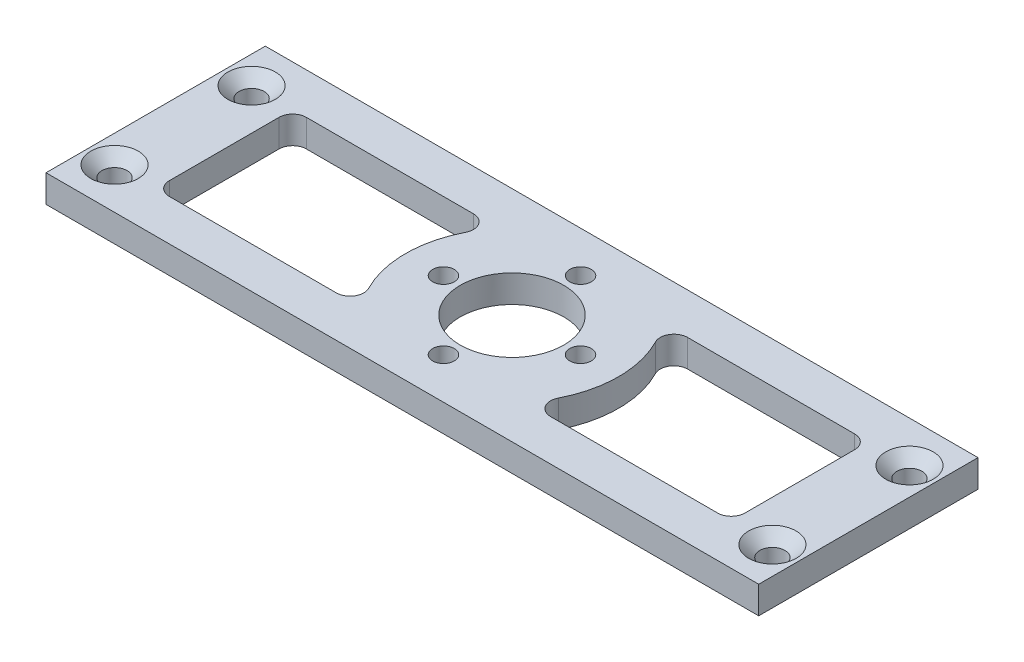
ISO-10303-21;
HEADER;
FILE_DESCRIPTION(('STEP AP214'),'2;1');
FILE_NAME('part.step','',(''),(''),'','','');
FILE_SCHEMA(('AUTOMOTIVE_DESIGN { 1 0 10303 214 1 1 1 1 }'));
ENDSEC;
DATA;
#1=APPLICATION_CONTEXT('core data for automotive mechanical design processes');
#2=APPLICATION_PROTOCOL_DEFINITION('international standard','automotive_design',2000,#1);
#3=PRODUCT_CONTEXT('',#1,'mechanical');
#4=PRODUCT('Part','Part','',(#3));
#5=PRODUCT_RELATED_PRODUCT_CATEGORY('part','',(#4));
#6=PRODUCT_DEFINITION_FORMATION('','',#4);
#7=PRODUCT_DEFINITION_CONTEXT('part definition',#1,'design');
#8=PRODUCT_DEFINITION('design','',#6,#7);
#9=PRODUCT_DEFINITION_SHAPE('','',#8);
#10=(LENGTH_UNIT() NAMED_UNIT(*) SI_UNIT(.MILLI.,.METRE.));
#11=(NAMED_UNIT(*) PLANE_ANGLE_UNIT() SI_UNIT($,.RADIAN.));
#12=(NAMED_UNIT(*) SI_UNIT($,.STERADIAN.) SOLID_ANGLE_UNIT());
#13=UNCERTAINTY_MEASURE_WITH_UNIT(LENGTH_MEASURE(1.E-05),#10,'distance_accuracy_value','');
#14=(GEOMETRIC_REPRESENTATION_CONTEXT(3) GLOBAL_UNCERTAINTY_ASSIGNED_CONTEXT((#13)) GLOBAL_UNIT_ASSIGNED_CONTEXT((#10,
#11,#12)) REPRESENTATION_CONTEXT('',''));
#15=CARTESIAN_POINT('',(0.,0.,0.));
#16=DIRECTION('',(0.,0.,1.));
#17=DIRECTION('',(1.,0.,0.));
#18=AXIS2_PLACEMENT_3D('',#15,#16,#17);
#19=CARTESIAN_POINT('',(0.,1.5875,0.));
#20=DIRECTION('',(0.,-1.,0.));
#21=DIRECTION('',(0.,0.,-1.));
#22=AXIS2_PLACEMENT_3D('',#19,#20,#21);
#23=PLANE('',#22);
#24=CARTESIAN_POINT('',(38.1,1.5875,-7.9375));
#25=DIRECTION('',(0.,1.,0.));
#26=DIRECTION('',(0.,0.,1.));
#27=AXIS2_PLACEMENT_3D('',#24,#25,#26);
#28=CIRCLE('',#27,2.75);
#29=CARTESIAN_POINT('',(38.1,1.5875,-5.1875));
#30=VERTEX_POINT('',#29);
#31=EDGE_CURVE('E373',#30,#30,#28,.T.);
#32=ORIENTED_EDGE('',*,*,#31,.F.);
#33=EDGE_LOOP('',(#32));
#34=FACE_BOUND('',#33,.T.);
#35=CARTESIAN_POINT('',(38.1,1.5875,7.9375));
#36=DIRECTION('',(0.,1.,0.));
#37=DIRECTION('',(0.,0.,1.));
#38=AXIS2_PLACEMENT_3D('',#35,#36,#37);
#39=CIRCLE('',#38,2.75);
#40=CARTESIAN_POINT('',(38.1,1.5875,10.6875));
#41=VERTEX_POINT('',#40);
#42=EDGE_CURVE('E395',#41,#41,#39,.T.);
#43=ORIENTED_EDGE('',*,*,#42,.F.);
#44=EDGE_LOOP('',(#43));
#45=FACE_BOUND('',#44,.T.);
#46=CARTESIAN_POINT('',(-38.1,1.5875,-7.9375));
#47=DIRECTION('',(0.,1.,0.));
#48=DIRECTION('',(0.,0.,1.));
#49=AXIS2_PLACEMENT_3D('',#46,#47,#48);
#50=CIRCLE('',#49,2.75);
#51=CARTESIAN_POINT('',(-38.1,1.5875,-5.1875));
#52=VERTEX_POINT('',#51);
#53=EDGE_CURVE('E407',#52,#52,#50,.T.);
#54=ORIENTED_EDGE('',*,*,#53,.F.);
#55=EDGE_LOOP('',(#54));
#56=FACE_BOUND('',#55,.T.);
#57=CARTESIAN_POINT('',(-38.1,1.5875,7.9375));
#58=DIRECTION('',(0.,1.,0.));
#59=DIRECTION('',(0.,0.,1.));
#60=AXIS2_PLACEMENT_3D('',#57,#58,#59);
#61=CIRCLE('',#60,2.75);
#62=CARTESIAN_POINT('',(-38.1,1.5875,10.6875));
#63=VERTEX_POINT('',#62);
#64=EDGE_CURVE('E419',#63,#63,#61,.T.);
#65=ORIENTED_EDGE('',*,*,#64,.F.);
#66=EDGE_LOOP('',(#65));
#67=FACE_BOUND('',#66,.T.);
#68=CARTESIAN_POINT('',(0.,1.5875,-7.9375));
#69=DIRECTION('',(0.,1.,0.));
#70=DIRECTION('',(0.,0.,1.));
#71=AXIS2_PLACEMENT_3D('',#68,#69,#70);
#72=CIRCLE('',#71,1.25);
#73=CARTESIAN_POINT('',(0.,1.5875,-6.6875));
#74=VERTEX_POINT('',#73);
#75=EDGE_CURVE('E431',#74,#74,#72,.T.);
#76=ORIENTED_EDGE('',*,*,#75,.F.);
#77=EDGE_LOOP('',(#76));
#78=FACE_BOUND('',#77,.T.);
#79=CARTESIAN_POINT('',(-7.9375,1.5875,0.));
#80=DIRECTION('',(0.,1.,0.));
#81=DIRECTION('',(0.,0.,1.));
#82=AXIS2_PLACEMENT_3D('',#79,#80,#81);
#83=CIRCLE('',#82,1.25);
#84=CARTESIAN_POINT('',(-7.9375,1.5875,1.25));
#85=VERTEX_POINT('',#84);
#86=EDGE_CURVE('E439',#85,#85,#83,.T.);
#87=ORIENTED_EDGE('',*,*,#86,.F.);
#88=EDGE_LOOP('',(#87));
#89=FACE_BOUND('',#88,.T.);
#90=CARTESIAN_POINT('',(7.9375,1.5875,0.));
#91=DIRECTION('',(0.,1.,0.));
#92=DIRECTION('',(0.,0.,1.));
#93=AXIS2_PLACEMENT_3D('',#90,#91,#92);
#94=CIRCLE('',#93,1.25);
#95=CARTESIAN_POINT('',(7.9375,1.5875,1.25));
#96=VERTEX_POINT('',#95);
#97=EDGE_CURVE('E447',#96,#96,#94,.T.);
#98=ORIENTED_EDGE('',*,*,#97,.F.);
#99=EDGE_LOOP('',(#98));
#100=FACE_BOUND('',#99,.T.);
#101=DIRECTION('',(0.,0.,-1.));
#102=VECTOR('',#101,1.);
#103=CARTESIAN_POINT('',(-41.275,1.5875,12.7));
#104=LINE('',#103,#102);
#105=CARTESIAN_POINT('',(-41.275,1.5875,12.7));
#106=VERTEX_POINT('',#105);
#107=CARTESIAN_POINT('',(-41.275,1.5875,-12.7));
#108=VERTEX_POINT('',#107);
#109=EDGE_CURVE('E201',#106,#108,#104,.T.);
#110=ORIENTED_EDGE('',*,*,#109,.F.);
#111=DIRECTION('',(1.,0.,0.));
#112=VECTOR('',#111,1.);
#113=CARTESIAN_POINT('',(-41.275,1.5875,12.7));
#114=LINE('',#113,#112);
#115=CARTESIAN_POINT('',(41.275,1.5875,12.7));
#116=VERTEX_POINT('',#115);
#117=EDGE_CURVE('E196',#106,#116,#114,.T.);
#118=ORIENTED_EDGE('',*,*,#117,.T.);
#119=DIRECTION('',(0.,0.,-1.));
#120=VECTOR('',#119,1.);
#121=CARTESIAN_POINT('',(41.275,1.5875,12.7));
#122=LINE('',#121,#120);
#123=CARTESIAN_POINT('',(41.275,1.5875,-12.7));
#124=VERTEX_POINT('',#123);
#125=EDGE_CURVE('E203',#116,#124,#122,.T.);
#126=ORIENTED_EDGE('',*,*,#125,.T.);
#127=DIRECTION('',(1.,0.,0.));
#128=VECTOR('',#127,1.);
#129=CARTESIAN_POINT('',(-41.275,1.5875,-12.7));
#130=LINE('',#129,#128);
#131=EDGE_CURVE('E187',#108,#124,#130,.T.);
#132=ORIENTED_EDGE('',*,*,#131,.F.);
#133=EDGE_LOOP('',(#110,#118,#126,#132));
#134=FACE_BOUND('',#133,.T.);
#135=CARTESIAN_POINT('',(0.,1.5875,0.));
#136=DIRECTION('',(0.,1.,0.));
#137=DIRECTION('',(0.,0.,1.));
#138=AXIS2_PLACEMENT_3D('',#135,#136,#137);
#139=CIRCLE('',#138,6.);
#140=CARTESIAN_POINT('',(0.,1.5875,6.));
#141=VERTEX_POINT('',#140);
#142=EDGE_CURVE('E462',#141,#141,#139,.T.);
#143=ORIENTED_EDGE('',*,*,#142,.F.);
#144=EDGE_LOOP('',(#143));
#145=FACE_BOUND('',#144,.T.);
#146=CARTESIAN_POINT('',(0.,1.5875,7.9375));
#147=DIRECTION('',(0.,1.,0.));
#148=DIRECTION('',(0.,0.,1.));
#149=AXIS2_PLACEMENT_3D('',#146,#147,#148);
#150=CIRCLE('',#149,1.25);
#151=CARTESIAN_POINT('',(0.,1.5875,9.1875));
#152=VERTEX_POINT('',#151);
#153=EDGE_CURVE('E455',#152,#152,#150,.T.);
#154=ORIENTED_EDGE('',*,*,#153,.F.);
#155=EDGE_LOOP('',(#154));
#156=FACE_BOUND('',#155,.T.);
#157=DIRECTION('',(0.,0.,1.));
#158=VECTOR('',#157,1.);
#159=CARTESIAN_POINT('',(-33.3375,1.5875,-7.9375));
#160=LINE('',#159,#158);
#161=CARTESIAN_POINT('',(-33.3375,1.5875,-6.35));
#162=VERTEX_POINT('',#161);
#163=CARTESIAN_POINT('',(-33.3375,1.5875,6.35));
#164=VERTEX_POINT('',#163);
#165=EDGE_CURVE('E344',#162,#164,#160,.T.);
#166=ORIENTED_EDGE('',*,*,#165,.F.);
#167=CARTESIAN_POINT('',(-31.75,1.5875,-6.35));
#168=DIRECTION('',(0.,-1.,0.));
#169=DIRECTION('',(0.,0.,-1.));
#170=AXIS2_PLACEMENT_3D('',#167,#168,#169);
#171=CIRCLE('',#170,1.5875);
#172=CARTESIAN_POINT('',(-31.75,1.5875,-7.9375));
#173=VERTEX_POINT('',#172);
#174=EDGE_CURVE('E55',#162,#173,#171,.T.);
#175=ORIENTED_EDGE('',*,*,#174,.T.);
#176=DIRECTION('',(-1.,0.,0.));
#177=VECTOR('',#176,1.);
#178=CARTESIAN_POINT('',(-33.3375,1.5875,-7.9375));
#179=LINE('',#178,#177);
#180=CARTESIAN_POINT('',(-12.4069096172254,1.5875,-7.9375));
#181=VERTEX_POINT('',#180);
#182=EDGE_CURVE('E343',#181,#173,#179,.T.);
#183=ORIENTED_EDGE('',*,*,#182,.F.);
#184=CARTESIAN_POINT('',(-12.4069096172254,1.5875,-6.35));
#185=DIRECTION('',(0.,-1.,0.));
#186=DIRECTION('',(0.,0.,-1.));
#187=AXIS2_PLACEMENT_3D('',#184,#185,#186);
#188=CIRCLE('',#187,1.5875);
#189=CARTESIAN_POINT('',(-10.9937459209136,1.5875,-5.6267264573991));
#190=VERTEX_POINT('',#189);
#191=EDGE_CURVE('E320',#181,#190,#188,.T.);
#192=ORIENTED_EDGE('',*,*,#191,.T.);
#193=CARTESIAN_POINT('',(0.,1.5875,0.));
#194=DIRECTION('',(0.,-1.,0.));
#195=DIRECTION('',(0.,0.,1.));
#196=AXIS2_PLACEMENT_3D('',#193,#194,#195);
#197=CIRCLE('',#196,12.35);
#198=CARTESIAN_POINT('',(-10.9937459209136,1.5875,5.6267264573991));
#199=VERTEX_POINT('',#198);
#200=EDGE_CURVE('E367',#199,#190,#197,.T.);
#201=ORIENTED_EDGE('',*,*,#200,.F.);
#202=CARTESIAN_POINT('',(-12.4069096172254,1.5875,6.35));
#203=DIRECTION('',(0.,-1.,0.));
#204=DIRECTION('',(0.,0.,-1.));
#205=AXIS2_PLACEMENT_3D('',#202,#203,#204);
#206=CIRCLE('',#205,1.5875);
#207=CARTESIAN_POINT('',(-12.4069096172254,1.5875,7.9375));
#208=VERTEX_POINT('',#207);
#209=EDGE_CURVE('E326',#199,#208,#206,.T.);
#210=ORIENTED_EDGE('',*,*,#209,.T.);
#211=DIRECTION('',(1.,0.,0.));
#212=VECTOR('',#211,1.);
#213=CARTESIAN_POINT('',(-33.3375,1.5875,7.9375));
#214=LINE('',#213,#212);
#215=CARTESIAN_POINT('',(-31.75,1.5875,7.9375));
#216=VERTEX_POINT('',#215);
#217=EDGE_CURVE('E377',#216,#208,#214,.T.);
#218=ORIENTED_EDGE('',*,*,#217,.F.);
#219=CARTESIAN_POINT('',(-31.75,1.5875,6.35));
#220=DIRECTION('',(0.,-1.,0.));
#221=DIRECTION('',(0.,0.,-1.));
#222=AXIS2_PLACEMENT_3D('',#219,#220,#221);
#223=CIRCLE('',#222,1.5875);
#224=EDGE_CURVE('E332',#216,#164,#223,.T.);
#225=ORIENTED_EDGE('',*,*,#224,.T.);
#226=EDGE_LOOP('',(#166,#175,#183,#192,#201,#210,#218,#225));
#227=FACE_BOUND('',#226,.T.);
#228=CARTESIAN_POINT('',(0.,1.5875,0.));
#229=DIRECTION('',(0.,1.,0.));
#230=DIRECTION('',(0.,0.,1.));
#231=AXIS2_PLACEMENT_3D('',#228,#229,#230);
#232=CIRCLE('',#231,12.35);
#233=CARTESIAN_POINT('',(10.9937459209136,1.5875,5.6267264573991));
#234=VERTEX_POINT('',#233);
#235=CARTESIAN_POINT('',(10.9937459209136,1.5875,-5.6267264573991));
#236=VERTEX_POINT('',#235);
#237=EDGE_CURVE('E508',#234,#236,#232,.T.);
#238=ORIENTED_EDGE('',*,*,#237,.T.);
#239=CARTESIAN_POINT('',(12.4069096172254,1.5875,-6.35));
#240=DIRECTION('',(0.,-1.,0.));
#241=DIRECTION('',(0.,0.,-1.));
#242=AXIS2_PLACEMENT_3D('',#239,#240,#241);
#243=CIRCLE('',#242,1.5875);
#244=CARTESIAN_POINT('',(12.4069096172254,1.5875,-7.9375));
#245=VERTEX_POINT('',#244);
#246=EDGE_CURVE('E296',#236,#245,#243,.T.);
#247=ORIENTED_EDGE('',*,*,#246,.T.);
#248=DIRECTION('',(1.,0.,0.));
#249=VECTOR('',#248,1.);
#250=CARTESIAN_POINT('',(33.3375,1.5875,-7.9375));
#251=LINE('',#250,#249);
#252=CARTESIAN_POINT('',(31.75,1.5875,-7.9375));
#253=VERTEX_POINT('',#252);
#254=EDGE_CURVE('E501',#245,#253,#251,.T.);
#255=ORIENTED_EDGE('',*,*,#254,.T.);
#256=CARTESIAN_POINT('',(31.75,1.5875,-6.35));
#257=DIRECTION('',(0.,-1.,0.));
#258=DIRECTION('',(0.,0.,-1.));
#259=AXIS2_PLACEMENT_3D('',#256,#257,#258);
#260=CIRCLE('',#259,1.5875);
#261=CARTESIAN_POINT('',(33.3375,1.5875,-6.35));
#262=VERTEX_POINT('',#261);
#263=EDGE_CURVE('E314',#253,#262,#260,.T.);
#264=ORIENTED_EDGE('',*,*,#263,.T.);
#265=DIRECTION('',(0.,0.,1.));
#266=VECTOR('',#265,1.);
#267=CARTESIAN_POINT('',(33.3375,1.5875,-7.9375));
#268=LINE('',#267,#266);
#269=CARTESIAN_POINT('',(33.3375,1.5875,6.35));
#270=VERTEX_POINT('',#269);
#271=EDGE_CURVE('E517',#262,#270,#268,.T.);
#272=ORIENTED_EDGE('',*,*,#271,.T.);
#273=CARTESIAN_POINT('',(31.75,1.5875,6.35));
#274=DIRECTION('',(0.,-1.,0.));
#275=DIRECTION('',(0.,0.,-1.));
#276=AXIS2_PLACEMENT_3D('',#273,#274,#275);
#277=CIRCLE('',#276,1.5875);
#278=CARTESIAN_POINT('',(31.75,1.5875,7.9375));
#279=VERTEX_POINT('',#278);
#280=EDGE_CURVE('E308',#270,#279,#277,.T.);
#281=ORIENTED_EDGE('',*,*,#280,.T.);
#282=DIRECTION('',(-1.,0.,0.));
#283=VECTOR('',#282,1.);
#284=CARTESIAN_POINT('',(33.3375,1.5875,7.9375));
#285=LINE('',#284,#283);
#286=CARTESIAN_POINT('',(12.4069096172254,1.5875,7.9375));
#287=VERTEX_POINT('',#286);
#288=EDGE_CURVE('E511',#279,#287,#285,.T.);
#289=ORIENTED_EDGE('',*,*,#288,.T.);
#290=CARTESIAN_POINT('',(12.4069096172254,1.5875,6.35));
#291=DIRECTION('',(0.,-1.,0.));
#292=DIRECTION('',(0.,0.,-1.));
#293=AXIS2_PLACEMENT_3D('',#290,#291,#292);
#294=CIRCLE('',#293,1.5875);
#295=EDGE_CURVE('E302',#287,#234,#294,.T.);
#296=ORIENTED_EDGE('',*,*,#295,.T.);
#297=EDGE_LOOP('',(#238,#247,#255,#264,#272,#281,#289,#296));
#298=FACE_BOUND('',#297,.T.);
#299=ADVANCED_FACE('F46',(#34,#45,#56,#67,#78,#89,#100,#134,#145,#156,#227,#298),#23,.F.);
#300=CARTESIAN_POINT('',(0.,-1.5875,0.));
#301=DIRECTION('',(0.,-1.,0.));
#302=DIRECTION('',(0.,0.,-1.));
#303=AXIS2_PLACEMENT_3D('',#300,#301,#302);
#304=PLANE('',#303);
#305=CARTESIAN_POINT('',(0.,-1.5875,0.));
#306=DIRECTION('',(0.,-1.,0.));
#307=DIRECTION('',(0.,0.,1.));
#308=AXIS2_PLACEMENT_3D('',#305,#306,#307);
#309=CIRCLE('',#308,12.35);
#310=CARTESIAN_POINT('',(-10.9937459209136,-1.5875,5.6267264573991));
#311=VERTEX_POINT('',#310);
#312=CARTESIAN_POINT('',(-10.9937459209136,-1.5875,-5.6267264573991));
#313=VERTEX_POINT('',#312);
#314=EDGE_CURVE('E365',#311,#313,#309,.T.);
#315=ORIENTED_EDGE('',*,*,#314,.T.);
#316=CARTESIAN_POINT('',(-12.4069096172254,-1.5875,-6.35));
#317=DIRECTION('',(0.,-1.,0.));
#318=DIRECTION('',(0.,0.,-1.));
#319=AXIS2_PLACEMENT_3D('',#316,#317,#318);
#320=CIRCLE('',#319,1.5875);
#321=CARTESIAN_POINT('',(-12.4069096172254,-1.5875,-7.9375));
#322=VERTEX_POINT('',#321);
#323=EDGE_CURVE('E323',#313,#322,#320,.F.);
#324=ORIENTED_EDGE('',*,*,#323,.T.);
#325=DIRECTION('',(-1.,0.,0.));
#326=VECTOR('',#325,1.);
#327=CARTESIAN_POINT('',(-33.3375,-1.5875,-7.9375));
#328=LINE('',#327,#326);
#329=CARTESIAN_POINT('',(-31.75,-1.5875,-7.9375));
#330=VERTEX_POINT('',#329);
#331=EDGE_CURVE('E360',#322,#330,#328,.T.);
#332=ORIENTED_EDGE('',*,*,#331,.T.);
#333=CARTESIAN_POINT('',(-31.75,-1.5875,-6.35));
#334=DIRECTION('',(0.,-1.,0.));
#335=DIRECTION('',(0.,0.,-1.));
#336=AXIS2_PLACEMENT_3D('',#333,#334,#335);
#337=CIRCLE('',#336,1.5875);
#338=CARTESIAN_POINT('',(-33.3375,-1.5875,-6.35));
#339=VERTEX_POINT('',#338);
#340=EDGE_CURVE('E11',#330,#339,#337,.F.);
#341=ORIENTED_EDGE('',*,*,#340,.T.);
#342=DIRECTION('',(0.,0.,1.));
#343=VECTOR('',#342,1.);
#344=CARTESIAN_POINT('',(-33.3375,-1.5875,-7.9375));
#345=LINE('',#344,#343);
#346=CARTESIAN_POINT('',(-33.3375,-1.5875,6.35));
#347=VERTEX_POINT('',#346);
#348=EDGE_CURVE('E356',#339,#347,#345,.T.);
#349=ORIENTED_EDGE('',*,*,#348,.T.);
#350=CARTESIAN_POINT('',(-31.75,-1.5875,6.35));
#351=DIRECTION('',(0.,-1.,0.));
#352=DIRECTION('',(0.,0.,-1.));
#353=AXIS2_PLACEMENT_3D('',#350,#351,#352);
#354=CIRCLE('',#353,1.5875);
#355=CARTESIAN_POINT('',(-31.75,-1.5875,7.9375));
#356=VERTEX_POINT('',#355);
#357=EDGE_CURVE('E335',#347,#356,#354,.F.);
#358=ORIENTED_EDGE('',*,*,#357,.T.);
#359=DIRECTION('',(1.,0.,0.));
#360=VECTOR('',#359,1.);
#361=CARTESIAN_POINT('',(-33.3375,-1.5875,7.9375));
#362=LINE('',#361,#360);
#363=CARTESIAN_POINT('',(-12.4069096172254,-1.5875,7.9375));
#364=VERTEX_POINT('',#363);
#365=EDGE_CURVE('E359',#356,#364,#362,.T.);
#366=ORIENTED_EDGE('',*,*,#365,.T.);
#367=CARTESIAN_POINT('',(-12.4069096172254,-1.5875,6.35));
#368=DIRECTION('',(0.,-1.,0.));
#369=DIRECTION('',(0.,0.,-1.));
#370=AXIS2_PLACEMENT_3D('',#367,#368,#369);
#371=CIRCLE('',#370,1.5875);
#372=EDGE_CURVE('E329',#364,#311,#371,.F.);
#373=ORIENTED_EDGE('',*,*,#372,.T.);
#374=EDGE_LOOP('',(#315,#324,#332,#341,#349,#358,#366,#373));
#375=FACE_BOUND('',#374,.T.);
#376=CARTESIAN_POINT('',(38.1,-1.5875,-7.9375));
#377=DIRECTION('',(0.,-1.,0.));
#378=DIRECTION('',(0.,0.,-1.));
#379=AXIS2_PLACEMENT_3D('',#376,#377,#378);
#380=CIRCLE('',#379,1.45);
#381=CARTESIAN_POINT('',(38.1,-1.5875,-9.3875));
#382=VERTEX_POINT('',#381);
#383=EDGE_CURVE('E391',#382,#382,#380,.T.);
#384=ORIENTED_EDGE('',*,*,#383,.F.);
#385=EDGE_LOOP('',(#384));
#386=FACE_BOUND('',#385,.T.);
#387=CARTESIAN_POINT('',(38.1,-1.5875,7.9375));
#388=DIRECTION('',(0.,-1.,0.));
#389=DIRECTION('',(0.,0.,-1.));
#390=AXIS2_PLACEMENT_3D('',#387,#388,#389);
#391=CIRCLE('',#390,1.45);
#392=CARTESIAN_POINT('',(38.1,-1.5875,6.4875));
#393=VERTEX_POINT('',#392);
#394=EDGE_CURVE('E403',#393,#393,#391,.T.);
#395=ORIENTED_EDGE('',*,*,#394,.F.);
#396=EDGE_LOOP('',(#395));
#397=FACE_BOUND('',#396,.T.);
#398=CARTESIAN_POINT('',(-38.1,-1.5875,-7.9375));
#399=DIRECTION('',(0.,-1.,0.));
#400=DIRECTION('',(0.,0.,-1.));
#401=AXIS2_PLACEMENT_3D('',#398,#399,#400);
#402=CIRCLE('',#401,1.45);
#403=CARTESIAN_POINT('',(-38.1,-1.5875,-9.3875));
#404=VERTEX_POINT('',#403);
#405=EDGE_CURVE('E415',#404,#404,#402,.T.);
#406=ORIENTED_EDGE('',*,*,#405,.F.);
#407=EDGE_LOOP('',(#406));
#408=FACE_BOUND('',#407,.T.);
#409=CARTESIAN_POINT('',(-38.1,-1.5875,7.9375));
#410=DIRECTION('',(0.,-1.,0.));
#411=DIRECTION('',(0.,0.,-1.));
#412=AXIS2_PLACEMENT_3D('',#409,#410,#411);
#413=CIRCLE('',#412,1.45);
#414=CARTESIAN_POINT('',(-38.1,-1.5875,6.4875));
#415=VERTEX_POINT('',#414);
#416=EDGE_CURVE('E427',#415,#415,#413,.T.);
#417=ORIENTED_EDGE('',*,*,#416,.F.);
#418=EDGE_LOOP('',(#417));
#419=FACE_BOUND('',#418,.T.);
#420=CARTESIAN_POINT('',(0.,-1.5875,-7.9375));
#421=DIRECTION('',(0.,-1.,0.));
#422=DIRECTION('',(0.,0.,-1.));
#423=AXIS2_PLACEMENT_3D('',#420,#421,#422);
#424=CIRCLE('',#423,1.25);
#425=CARTESIAN_POINT('',(0.,-1.5875,-9.1875));
#426=VERTEX_POINT('',#425);
#427=EDGE_CURVE('E435',#426,#426,#424,.T.);
#428=ORIENTED_EDGE('',*,*,#427,.F.);
#429=EDGE_LOOP('',(#428));
#430=FACE_BOUND('',#429,.T.);
#431=CARTESIAN_POINT('',(-7.9375,-1.5875,0.));
#432=DIRECTION('',(0.,-1.,0.));
#433=DIRECTION('',(0.,0.,-1.));
#434=AXIS2_PLACEMENT_3D('',#431,#432,#433);
#435=CIRCLE('',#434,1.25);
#436=CARTESIAN_POINT('',(-7.9375,-1.5875,-1.25));
#437=VERTEX_POINT('',#436);
#438=EDGE_CURVE('E443',#437,#437,#435,.T.);
#439=ORIENTED_EDGE('',*,*,#438,.F.);
#440=EDGE_LOOP('',(#439));
#441=FACE_BOUND('',#440,.T.);
#442=CARTESIAN_POINT('',(7.9375,-1.5875,0.));
#443=DIRECTION('',(0.,-1.,0.));
#444=DIRECTION('',(0.,0.,-1.));
#445=AXIS2_PLACEMENT_3D('',#442,#443,#444);
#446=CIRCLE('',#445,1.25);
#447=CARTESIAN_POINT('',(7.9375,-1.5875,-1.25));
#448=VERTEX_POINT('',#447);
#449=EDGE_CURVE('E451',#448,#448,#446,.T.);
#450=ORIENTED_EDGE('',*,*,#449,.F.);
#451=EDGE_LOOP('',(#450));
#452=FACE_BOUND('',#451,.T.);
#453=CARTESIAN_POINT('',(0.,-1.5875,7.9375));
#454=DIRECTION('',(0.,-1.,0.));
#455=DIRECTION('',(0.,0.,-1.));
#456=AXIS2_PLACEMENT_3D('',#453,#454,#455);
#457=CIRCLE('',#456,1.25);
#458=CARTESIAN_POINT('',(0.,-1.5875,6.6875));
#459=VERTEX_POINT('',#458);
#460=EDGE_CURVE('E459',#459,#459,#457,.T.);
#461=ORIENTED_EDGE('',*,*,#460,.F.);
#462=EDGE_LOOP('',(#461));
#463=FACE_BOUND('',#462,.T.);
#464=CARTESIAN_POINT('',(0.,-1.5875,0.));
#465=DIRECTION('',(0.,-1.,0.));
#466=DIRECTION('',(0.,0.,-1.));
#467=AXIS2_PLACEMENT_3D('',#464,#465,#466);
#468=CIRCLE('',#467,6.);
#469=CARTESIAN_POINT('',(0.,-1.5875,-6.));
#470=VERTEX_POINT('',#469);
#471=EDGE_CURVE('E218',#470,#470,#468,.T.);
#472=ORIENTED_EDGE('',*,*,#471,.F.);
#473=EDGE_LOOP('',(#472));
#474=FACE_BOUND('',#473,.T.);
#475=DIRECTION('',(0.,0.,-1.));
#476=VECTOR('',#475,1.);
#477=CARTESIAN_POINT('',(-41.275,-1.5875,12.7));
#478=LINE('',#477,#476);
#479=CARTESIAN_POINT('',(-41.275,-1.5875,12.7));
#480=VERTEX_POINT('',#479);
#481=CARTESIAN_POINT('',(-41.275,-1.5875,-12.7));
#482=VERTEX_POINT('',#481);
#483=EDGE_CURVE('E225',#480,#482,#478,.T.);
#484=ORIENTED_EDGE('',*,*,#483,.T.);
#485=DIRECTION('',(1.,0.,0.));
#486=VECTOR('',#485,1.);
#487=CARTESIAN_POINT('',(-41.275,-1.5875,-12.7));
#488=LINE('',#487,#486);
#489=CARTESIAN_POINT('',(41.275,-1.5875,-12.7));
#490=VERTEX_POINT('',#489);
#491=EDGE_CURVE('E189',#482,#490,#488,.T.);
#492=ORIENTED_EDGE('',*,*,#491,.T.);
#493=DIRECTION('',(0.,0.,-1.));
#494=VECTOR('',#493,1.);
#495=CARTESIAN_POINT('',(41.275,-1.5875,12.7));
#496=LINE('',#495,#494);
#497=CARTESIAN_POINT('',(41.275,-1.5875,12.7));
#498=VERTEX_POINT('',#497);
#499=EDGE_CURVE('E215',#498,#490,#496,.T.);
#500=ORIENTED_EDGE('',*,*,#499,.F.);
#501=DIRECTION('',(1.,0.,0.));
#502=VECTOR('',#501,1.);
#503=CARTESIAN_POINT('',(-41.275,-1.5875,12.7));
#504=LINE('',#503,#502);
#505=EDGE_CURVE('E211',#480,#498,#504,.T.);
#506=ORIENTED_EDGE('',*,*,#505,.F.);
#507=EDGE_LOOP('',(#484,#492,#500,#506));
#508=FACE_BOUND('',#507,.T.);
#509=DIRECTION('',(0.,0.,1.));
#510=VECTOR('',#509,1.);
#511=CARTESIAN_POINT('',(33.3375,-1.5875,-7.9375));
#512=LINE('',#511,#510);
#513=CARTESIAN_POINT('',(33.3375,-1.5875,-6.35));
#514=VERTEX_POINT('',#513);
#515=CARTESIAN_POINT('',(33.3375,-1.5875,6.35));
#516=VERTEX_POINT('',#515);
#517=EDGE_CURVE('E353',#514,#516,#512,.T.);
#518=ORIENTED_EDGE('',*,*,#517,.F.);
#519=CARTESIAN_POINT('',(31.75,-1.5875,-6.35));
#520=DIRECTION('',(0.,-1.,0.));
#521=DIRECTION('',(0.,0.,-1.));
#522=AXIS2_PLACEMENT_3D('',#519,#520,#521);
#523=CIRCLE('',#522,1.5875);
#524=CARTESIAN_POINT('',(31.75,-1.5875,-7.9375));
#525=VERTEX_POINT('',#524);
#526=EDGE_CURVE('E317',#514,#525,#523,.F.);
#527=ORIENTED_EDGE('',*,*,#526,.T.);
#528=DIRECTION('',(1.,0.,0.));
#529=VECTOR('',#528,1.);
#530=CARTESIAN_POINT('',(33.3375,-1.5875,-7.9375));
#531=LINE('',#530,#529);
#532=CARTESIAN_POINT('',(12.4069096172254,-1.5875,-7.9375));
#533=VERTEX_POINT('',#532);
#534=EDGE_CURVE('E503',#533,#525,#531,.T.);
#535=ORIENTED_EDGE('',*,*,#534,.F.);
#536=CARTESIAN_POINT('',(12.4069096172254,-1.5875,-6.35));
#537=DIRECTION('',(0.,-1.,0.));
#538=DIRECTION('',(0.,0.,-1.));
#539=AXIS2_PLACEMENT_3D('',#536,#537,#538);
#540=CIRCLE('',#539,1.5875);
#541=CARTESIAN_POINT('',(10.9937459209136,-1.5875,-5.6267264573991));
#542=VERTEX_POINT('',#541);
#543=EDGE_CURVE('E299',#533,#542,#540,.F.);
#544=ORIENTED_EDGE('',*,*,#543,.T.);
#545=CARTESIAN_POINT('',(0.,-1.5875,0.));
#546=DIRECTION('',(0.,1.,0.));
#547=DIRECTION('',(0.,0.,1.));
#548=AXIS2_PLACEMENT_3D('',#545,#546,#547);
#549=CIRCLE('',#548,12.35);
#550=CARTESIAN_POINT('',(10.9937459209136,-1.5875,5.6267264573991));
#551=VERTEX_POINT('',#550);
#552=EDGE_CURVE('E520',#551,#542,#549,.T.);
#553=ORIENTED_EDGE('',*,*,#552,.F.);
#554=CARTESIAN_POINT('',(12.4069096172254,-1.5875,6.35));
#555=DIRECTION('',(0.,-1.,0.));
#556=DIRECTION('',(0.,0.,-1.));
#557=AXIS2_PLACEMENT_3D('',#554,#555,#556);
#558=CIRCLE('',#557,1.5875);
#559=CARTESIAN_POINT('',(12.4069096172254,-1.5875,7.9375));
#560=VERTEX_POINT('',#559);
#561=EDGE_CURVE('E305',#551,#560,#558,.F.);
#562=ORIENTED_EDGE('',*,*,#561,.T.);
#563=DIRECTION('',(-1.,0.,0.));
#564=VECTOR('',#563,1.);
#565=CARTESIAN_POINT('',(33.3375,-1.5875,7.9375));
#566=LINE('',#565,#564);
#567=CARTESIAN_POINT('',(31.75,-1.5875,7.9375));
#568=VERTEX_POINT('',#567);
#569=EDGE_CURVE('E491',#568,#560,#566,.T.);
#570=ORIENTED_EDGE('',*,*,#569,.F.);
#571=CARTESIAN_POINT('',(31.75,-1.5875,6.35));
#572=DIRECTION('',(0.,-1.,0.));
#573=DIRECTION('',(0.,0.,-1.));
#574=AXIS2_PLACEMENT_3D('',#571,#572,#573);
#575=CIRCLE('',#574,1.5875);
#576=EDGE_CURVE('E311',#568,#516,#575,.F.);
#577=ORIENTED_EDGE('',*,*,#576,.T.);
#578=EDGE_LOOP('',(#518,#527,#535,#544,#553,#562,#570,#577));
#579=FACE_BOUND('',#578,.T.);
#580=ADVANCED_FACE('F475',(#375,#386,#397,#408,#419,#430,#441,#452,#463,#474,#508,#579),#304,.T.);
#581=CARTESIAN_POINT('',(-41.275,1.5875,12.7));
#582=DIRECTION('',(-1.,0.,0.));
#583=DIRECTION('',(0.,0.,1.));
#584=AXIS2_PLACEMENT_3D('',#581,#582,#583);
#585=PLANE('',#584);
#586=ORIENTED_EDGE('',*,*,#483,.F.);
#587=DIRECTION('',(0.,-1.,0.));
#588=VECTOR('',#587,1.);
#589=CARTESIAN_POINT('',(-41.275,1.5875,12.7));
#590=LINE('',#589,#588);
#591=EDGE_CURVE('E208',#106,#480,#590,.T.);
#592=ORIENTED_EDGE('',*,*,#591,.F.);
#593=ORIENTED_EDGE('',*,*,#109,.T.);
#594=DIRECTION('',(0.,-1.,0.));
#595=VECTOR('',#594,1.);
#596=CARTESIAN_POINT('',(-41.275,1.5875,-12.7));
#597=LINE('',#596,#595);
#598=EDGE_CURVE('E184',#108,#482,#597,.T.);
#599=ORIENTED_EDGE('',*,*,#598,.T.);
#600=EDGE_LOOP('',(#586,#592,#593,#599));
#601=FACE_BOUND('',#600,.T.);
#602=ADVANCED_FACE('F207',(#601),#585,.T.);
#603=CARTESIAN_POINT('',(-41.275,1.5875,12.7));
#604=DIRECTION('',(0.,0.,-1.));
#605=DIRECTION('',(-1.,0.,0.));
#606=AXIS2_PLACEMENT_3D('',#603,#604,#605);
#607=PLANE('',#606);
#608=ORIENTED_EDGE('',*,*,#505,.T.);
#609=DIRECTION('',(0.,-1.,0.));
#610=VECTOR('',#609,1.);
#611=CARTESIAN_POINT('',(41.275,1.5875,12.7));
#612=LINE('',#611,#610);
#613=EDGE_CURVE('E236',#116,#498,#612,.T.);
#614=ORIENTED_EDGE('',*,*,#613,.F.);
#615=ORIENTED_EDGE('',*,*,#117,.F.);
#616=ORIENTED_EDGE('',*,*,#591,.T.);
#617=EDGE_LOOP('',(#608,#614,#615,#616));
#618=FACE_BOUND('',#617,.T.);
#619=ADVANCED_FACE('F565',(#618),#607,.F.);
#620=CARTESIAN_POINT('',(41.275,1.5875,12.7));
#621=DIRECTION('',(-1.,0.,0.));
#622=DIRECTION('',(0.,0.,1.));
#623=AXIS2_PLACEMENT_3D('',#620,#621,#622);
#624=PLANE('',#623);
#625=ORIENTED_EDGE('',*,*,#499,.T.);
#626=DIRECTION('',(0.,-1.,0.));
#627=VECTOR('',#626,1.);
#628=CARTESIAN_POINT('',(41.275,1.5875,-12.7));
#629=LINE('',#628,#627);
#630=EDGE_CURVE('E195',#124,#490,#629,.T.);
#631=ORIENTED_EDGE('',*,*,#630,.F.);
#632=ORIENTED_EDGE('',*,*,#125,.F.);
#633=ORIENTED_EDGE('',*,*,#613,.T.);
#634=EDGE_LOOP('',(#625,#631,#632,#633));
#635=FACE_BOUND('',#634,.T.);
#636=ADVANCED_FACE('F568',(#635),#624,.F.);
#637=CARTESIAN_POINT('',(-41.275,1.5875,-12.7));
#638=DIRECTION('',(0.,0.,-1.));
#639=DIRECTION('',(-1.,0.,0.));
#640=AXIS2_PLACEMENT_3D('',#637,#638,#639);
#641=PLANE('',#640);
#642=ORIENTED_EDGE('',*,*,#491,.F.);
#643=ORIENTED_EDGE('',*,*,#598,.F.);
#644=ORIENTED_EDGE('',*,*,#131,.T.);
#645=ORIENTED_EDGE('',*,*,#630,.T.);
#646=EDGE_LOOP('',(#642,#643,#644,#645));
#647=FACE_BOUND('',#646,.T.);
#648=ADVANCED_FACE('F186',(#647),#641,.T.);
#649=CARTESIAN_POINT('',(0.,1.5875,0.));
#650=DIRECTION('',(0.,1.,0.));
#651=DIRECTION('',(0.,0.,1.));
#652=AXIS2_PLACEMENT_3D('',#649,#650,#651);
#653=CYLINDRICAL_SURFACE('',#652,6.);
#654=ORIENTED_EDGE('',*,*,#142,.T.);
#655=EDGE_LOOP('',(#654));
#656=FACE_BOUND('',#655,.T.);
#657=ORIENTED_EDGE('',*,*,#471,.T.);
#658=EDGE_LOOP('',(#657));
#659=FACE_BOUND('',#658,.T.);
#660=ADVANCED_FACE('F473',(#656,#659),#653,.F.);
#661=CARTESIAN_POINT('',(0.,1.5875,7.9375));
#662=DIRECTION('',(0.,1.,0.));
#663=DIRECTION('',(0.,0.,1.));
#664=AXIS2_PLACEMENT_3D('',#661,#662,#663);
#665=CYLINDRICAL_SURFACE('',#664,1.25);
#666=ORIENTED_EDGE('',*,*,#153,.T.);
#667=EDGE_LOOP('',(#666));
#668=FACE_BOUND('',#667,.T.);
#669=ORIENTED_EDGE('',*,*,#460,.T.);
#670=EDGE_LOOP('',(#669));
#671=FACE_BOUND('',#670,.T.);
#672=ADVANCED_FACE('F591',(#668,#671),#665,.F.);
#673=CARTESIAN_POINT('',(7.9375,1.5875,0.));
#674=DIRECTION('',(0.,1.,0.));
#675=DIRECTION('',(0.,0.,1.));
#676=AXIS2_PLACEMENT_3D('',#673,#674,#675);
#677=CYLINDRICAL_SURFACE('',#676,1.25);
#678=ORIENTED_EDGE('',*,*,#97,.T.);
#679=EDGE_LOOP('',(#678));
#680=FACE_BOUND('',#679,.T.);
#681=ORIENTED_EDGE('',*,*,#449,.T.);
#682=EDGE_LOOP('',(#681));
#683=FACE_BOUND('',#682,.T.);
#684=ADVANCED_FACE('F596',(#680,#683),#677,.F.);
#685=CARTESIAN_POINT('',(-7.9375,1.5875,0.));
#686=DIRECTION('',(0.,1.,0.));
#687=DIRECTION('',(0.,0.,1.));
#688=AXIS2_PLACEMENT_3D('',#685,#686,#687);
#689=CYLINDRICAL_SURFACE('',#688,1.25);
#690=ORIENTED_EDGE('',*,*,#86,.T.);
#691=EDGE_LOOP('',(#690));
#692=FACE_BOUND('',#691,.T.);
#693=ORIENTED_EDGE('',*,*,#438,.T.);
#694=EDGE_LOOP('',(#693));
#695=FACE_BOUND('',#694,.T.);
#696=ADVANCED_FACE('F602',(#692,#695),#689,.F.);
#697=CARTESIAN_POINT('',(0.,1.5875,-7.9375));
#698=DIRECTION('',(0.,1.,0.));
#699=DIRECTION('',(0.,0.,1.));
#700=AXIS2_PLACEMENT_3D('',#697,#698,#699);
#701=CYLINDRICAL_SURFACE('',#700,1.25);
#702=ORIENTED_EDGE('',*,*,#75,.T.);
#703=EDGE_LOOP('',(#702));
#704=FACE_BOUND('',#703,.T.);
#705=ORIENTED_EDGE('',*,*,#427,.T.);
#706=EDGE_LOOP('',(#705));
#707=FACE_BOUND('',#706,.T.);
#708=ADVANCED_FACE('F609',(#704,#707),#701,.F.);
#709=CARTESIAN_POINT('',(-38.1,1.5875,7.9375));
#710=DIRECTION('',(0.,1.,0.));
#711=DIRECTION('',(0.,0.,1.));
#712=AXIS2_PLACEMENT_3D('',#709,#710,#711);
#713=CYLINDRICAL_SURFACE('',#712,1.45);
#714=CARTESIAN_POINT('',(-38.1,0.2875,7.9375));
#715=DIRECTION('',(0.,1.,0.));
#716=DIRECTION('',(0.,0.,1.));
#717=AXIS2_PLACEMENT_3D('',#714,#715,#716);
#718=CIRCLE('',#717,1.45);
#719=CARTESIAN_POINT('',(-38.1,0.2875,9.3875));
#720=VERTEX_POINT('',#719);
#721=EDGE_CURVE('E423',#720,#720,#718,.T.);
#722=ORIENTED_EDGE('',*,*,#721,.T.);
#723=EDGE_LOOP('',(#722));
#724=FACE_BOUND('',#723,.T.);
#725=ORIENTED_EDGE('',*,*,#416,.T.);
#726=EDGE_LOOP('',(#725));
#727=FACE_BOUND('',#726,.T.);
#728=ADVANCED_FACE('F616',(#724,#727),#713,.F.);
#729=CARTESIAN_POINT('',(-38.1,1.5875,7.9375));
#730=DIRECTION('',(0.,1.,0.));
#731=DIRECTION('',(0.,0.,1.));
#732=AXIS2_PLACEMENT_3D('',#729,#730,#731);
#733=CONICAL_SURFACE('',#732,2.75,0.78539816339745);
#734=ORIENTED_EDGE('',*,*,#721,.F.);
#735=EDGE_LOOP('',(#734));
#736=FACE_BOUND('',#735,.T.);
#737=ORIENTED_EDGE('',*,*,#64,.T.);
#738=EDGE_LOOP('',(#737));
#739=FACE_BOUND('',#738,.T.);
#740=ADVANCED_FACE('F623',(#736,#739),#733,.F.);
#741=CARTESIAN_POINT('',(-38.1,1.5875,-7.9375));
#742=DIRECTION('',(0.,1.,0.));
#743=DIRECTION('',(0.,0.,1.));
#744=AXIS2_PLACEMENT_3D('',#741,#742,#743);
#745=CYLINDRICAL_SURFACE('',#744,1.45);
#746=CARTESIAN_POINT('',(-38.1,0.2875,-7.9375));
#747=DIRECTION('',(0.,1.,0.));
#748=DIRECTION('',(0.,0.,1.));
#749=AXIS2_PLACEMENT_3D('',#746,#747,#748);
#750=CIRCLE('',#749,1.45);
#751=CARTESIAN_POINT('',(-38.1,0.2875,-6.4875));
#752=VERTEX_POINT('',#751);
#753=EDGE_CURVE('E411',#752,#752,#750,.T.);
#754=ORIENTED_EDGE('',*,*,#753,.T.);
#755=EDGE_LOOP('',(#754));
#756=FACE_BOUND('',#755,.T.);
#757=ORIENTED_EDGE('',*,*,#405,.T.);
#758=EDGE_LOOP('',(#757));
#759=FACE_BOUND('',#758,.T.);
#760=ADVANCED_FACE('F630',(#756,#759),#745,.F.);
#761=CARTESIAN_POINT('',(-38.1,1.5875,-7.9375));
#762=DIRECTION('',(0.,1.,0.));
#763=DIRECTION('',(0.,0.,1.));
#764=AXIS2_PLACEMENT_3D('',#761,#762,#763);
#765=CONICAL_SURFACE('',#764,2.75,0.78539816339745);
#766=ORIENTED_EDGE('',*,*,#753,.F.);
#767=EDGE_LOOP('',(#766));
#768=FACE_BOUND('',#767,.T.);
#769=ORIENTED_EDGE('',*,*,#53,.T.);
#770=EDGE_LOOP('',(#769));
#771=FACE_BOUND('',#770,.T.);
#772=ADVANCED_FACE('F637',(#768,#771),#765,.F.);
#773=CARTESIAN_POINT('',(38.1,1.5875,7.9375));
#774=DIRECTION('',(0.,1.,0.));
#775=DIRECTION('',(0.,0.,1.));
#776=AXIS2_PLACEMENT_3D('',#773,#774,#775);
#777=CYLINDRICAL_SURFACE('',#776,1.45);
#778=CARTESIAN_POINT('',(38.1,0.2875,7.9375));
#779=DIRECTION('',(0.,1.,0.));
#780=DIRECTION('',(0.,0.,1.));
#781=AXIS2_PLACEMENT_3D('',#778,#779,#780);
#782=CIRCLE('',#781,1.45);
#783=CARTESIAN_POINT('',(38.1,0.2875,9.3875));
#784=VERTEX_POINT('',#783);
#785=EDGE_CURVE('E399',#784,#784,#782,.T.);
#786=ORIENTED_EDGE('',*,*,#785,.T.);
#787=EDGE_LOOP('',(#786));
#788=FACE_BOUND('',#787,.T.);
#789=ORIENTED_EDGE('',*,*,#394,.T.);
#790=EDGE_LOOP('',(#789));
#791=FACE_BOUND('',#790,.T.);
#792=ADVANCED_FACE('F644',(#788,#791),#777,.F.);
#793=CARTESIAN_POINT('',(38.1,1.5875,7.9375));
#794=DIRECTION('',(0.,1.,0.));
#795=DIRECTION('',(0.,0.,1.));
#796=AXIS2_PLACEMENT_3D('',#793,#794,#795);
#797=CONICAL_SURFACE('',#796,2.75,0.78539816339745);
#798=ORIENTED_EDGE('',*,*,#785,.F.);
#799=EDGE_LOOP('',(#798));
#800=FACE_BOUND('',#799,.T.);
#801=ORIENTED_EDGE('',*,*,#42,.T.);
#802=EDGE_LOOP('',(#801));
#803=FACE_BOUND('',#802,.T.);
#804=ADVANCED_FACE('F651',(#800,#803),#797,.F.);
#805=CARTESIAN_POINT('',(38.1,1.5875,-7.9375));
#806=DIRECTION('',(0.,1.,0.));
#807=DIRECTION('',(0.,0.,1.));
#808=AXIS2_PLACEMENT_3D('',#805,#806,#807);
#809=CYLINDRICAL_SURFACE('',#808,1.45);
#810=CARTESIAN_POINT('',(38.1,0.2875,-7.9375));
#811=DIRECTION('',(0.,1.,0.));
#812=DIRECTION('',(0.,0.,1.));
#813=AXIS2_PLACEMENT_3D('',#810,#811,#812);
#814=CIRCLE('',#813,1.45);
#815=CARTESIAN_POINT('',(38.1,0.2875,-6.4875));
#816=VERTEX_POINT('',#815);
#817=EDGE_CURVE('E387',#816,#816,#814,.T.);
#818=ORIENTED_EDGE('',*,*,#817,.T.);
#819=EDGE_LOOP('',(#818));
#820=FACE_BOUND('',#819,.T.);
#821=ORIENTED_EDGE('',*,*,#383,.T.);
#822=EDGE_LOOP('',(#821));
#823=FACE_BOUND('',#822,.T.);
#824=ADVANCED_FACE('F658',(#820,#823),#809,.F.);
#825=CARTESIAN_POINT('',(38.1,1.5875,-7.9375));
#826=DIRECTION('',(0.,1.,0.));
#827=DIRECTION('',(0.,0.,1.));
#828=AXIS2_PLACEMENT_3D('',#825,#826,#827);
#829=CONICAL_SURFACE('',#828,2.75,0.78539816339745);
#830=ORIENTED_EDGE('',*,*,#817,.F.);
#831=EDGE_LOOP('',(#830));
#832=FACE_BOUND('',#831,.T.);
#833=ORIENTED_EDGE('',*,*,#31,.T.);
#834=EDGE_LOOP('',(#833));
#835=FACE_BOUND('',#834,.T.);
#836=ADVANCED_FACE('F665',(#832,#835),#829,.F.);
#837=CARTESIAN_POINT('',(-33.3375,-1.5875,-7.9375));
#838=DIRECTION('',(0.,0.,-1.));
#839=DIRECTION('',(-1.,0.,0.));
#840=AXIS2_PLACEMENT_3D('',#837,#838,#839);
#841=PLANE('',#840);
#842=ORIENTED_EDGE('',*,*,#331,.F.);
#843=DIRECTION('',(0.,-1.,0.));
#844=VECTOR('',#843,1.);
#845=CARTESIAN_POINT('',(-12.4069096172254,1.5875,-7.9375));
#846=LINE('',#845,#844);
#847=EDGE_CURVE('E272',#322,#181,#846,.F.);
#848=ORIENTED_EDGE('',*,*,#847,.T.);
#849=ORIENTED_EDGE('',*,*,#182,.T.);
#850=DIRECTION('',(0.,1.,0.));
#851=VECTOR('',#850,1.);
#852=CARTESIAN_POINT('',(-31.75,-1.5875,-7.9375));
#853=LINE('',#852,#851);
#854=EDGE_CURVE('E269',#173,#330,#853,.F.);
#855=ORIENTED_EDGE('',*,*,#854,.T.);
#856=EDGE_LOOP('',(#842,#848,#849,#855));
#857=FACE_BOUND('',#856,.T.);
#858=ADVANCED_FACE('F350',(#857),#841,.F.);
#859=CARTESIAN_POINT('',(0.,-1.5875,0.));
#860=DIRECTION('',(0.,1.,0.));
#861=DIRECTION('',(0.,0.,1.));
#862=AXIS2_PLACEMENT_3D('',#859,#860,#861);
#863=CYLINDRICAL_SURFACE('',#862,12.35);
#864=ORIENTED_EDGE('',*,*,#200,.T.);
#865=DIRECTION('',(0.,1.,0.));
#866=VECTOR('',#865,1.);
#867=CARTESIAN_POINT('',(-10.9937459209136,-1.5875,-5.6267264573991));
#868=LINE('',#867,#866);
#869=EDGE_CURVE('E280',#190,#313,#868,.F.);
#870=ORIENTED_EDGE('',*,*,#869,.T.);
#871=ORIENTED_EDGE('',*,*,#314,.F.);
#872=DIRECTION('',(0.,1.,0.));
#873=VECTOR('',#872,1.);
#874=CARTESIAN_POINT('',(-10.9937459209136,-1.5875,5.6267264573991));
#875=LINE('',#874,#873);
#876=EDGE_CURVE('E276',#311,#199,#875,.T.);
#877=ORIENTED_EDGE('',*,*,#876,.T.);
#878=EDGE_LOOP('',(#864,#870,#871,#877));
#879=FACE_BOUND('',#878,.T.);
#880=ADVANCED_FACE('F685',(#879),#863,.T.);
#881=CARTESIAN_POINT('',(-33.3375,-1.5875,7.9375));
#882=DIRECTION('',(0.,0.,1.));
#883=DIRECTION('',(1.,0.,0.));
#884=AXIS2_PLACEMENT_3D('',#881,#882,#883);
#885=PLANE('',#884);
#886=ORIENTED_EDGE('',*,*,#217,.T.);
#887=DIRECTION('',(0.,-1.,0.));
#888=VECTOR('',#887,1.);
#889=CARTESIAN_POINT('',(-12.4069096172254,-1.5875,7.9375));
#890=LINE('',#889,#888);
#891=EDGE_CURVE('E287',#208,#364,#890,.T.);
#892=ORIENTED_EDGE('',*,*,#891,.T.);
#893=ORIENTED_EDGE('',*,*,#365,.F.);
#894=DIRECTION('',(0.,1.,0.));
#895=VECTOR('',#894,1.);
#896=CARTESIAN_POINT('',(-31.75,1.5875,7.9375));
#897=LINE('',#896,#895);
#898=EDGE_CURVE('E283',#356,#216,#897,.T.);
#899=ORIENTED_EDGE('',*,*,#898,.T.);
#900=EDGE_LOOP('',(#886,#892,#893,#899));
#901=FACE_BOUND('',#900,.T.);
#902=ADVANCED_FACE('F692',(#901),#885,.F.);
#903=CARTESIAN_POINT('',(-33.3375,-1.5875,-7.9375));
#904=DIRECTION('',(-1.,0.,0.));
#905=DIRECTION('',(0.,0.,1.));
#906=AXIS2_PLACEMENT_3D('',#903,#904,#905);
#907=PLANE('',#906);
#908=ORIENTED_EDGE('',*,*,#165,.T.);
#909=DIRECTION('',(0.,1.,0.));
#910=VECTOR('',#909,1.);
#911=CARTESIAN_POINT('',(-33.3375,-1.5875,6.35));
#912=LINE('',#911,#910);
#913=EDGE_CURVE('E62',#164,#347,#912,.F.);
#914=ORIENTED_EDGE('',*,*,#913,.T.);
#915=ORIENTED_EDGE('',*,*,#348,.F.);
#916=DIRECTION('',(0.,1.,0.));
#917=VECTOR('',#916,1.);
#918=CARTESIAN_POINT('',(-33.3375,1.5875,-6.35));
#919=LINE('',#918,#917);
#920=EDGE_CURVE('E290',#339,#162,#919,.T.);
#921=ORIENTED_EDGE('',*,*,#920,.T.);
#922=EDGE_LOOP('',(#908,#914,#915,#921));
#923=FACE_BOUND('',#922,.T.);
#924=ADVANCED_FACE('F355',(#923),#907,.F.);
#925=CARTESIAN_POINT('',(33.3375,-1.5875,-7.9375));
#926=DIRECTION('',(0.,0.,1.));
#927=DIRECTION('',(1.,0.,0.));
#928=AXIS2_PLACEMENT_3D('',#925,#926,#927);
#929=PLANE('',#928);
#930=ORIENTED_EDGE('',*,*,#254,.F.);
#931=DIRECTION('',(0.,-1.,0.));
#932=VECTOR('',#931,1.);
#933=CARTESIAN_POINT('',(12.4069096172254,-1.5875,-7.9375));
#934=LINE('',#933,#932);
#935=EDGE_CURVE('E252',#245,#533,#934,.T.);
#936=ORIENTED_EDGE('',*,*,#935,.T.);
#937=ORIENTED_EDGE('',*,*,#534,.T.);
#938=DIRECTION('',(0.,1.,0.));
#939=VECTOR('',#938,1.);
#940=CARTESIAN_POINT('',(31.75,1.5875,-7.9375));
#941=LINE('',#940,#939);
#942=EDGE_CURVE('E248',#525,#253,#941,.T.);
#943=ORIENTED_EDGE('',*,*,#942,.T.);
#944=EDGE_LOOP('',(#930,#936,#937,#943));
#945=FACE_BOUND('',#944,.T.);
#946=ADVANCED_FACE('F500',(#945),#929,.T.);
#947=CARTESIAN_POINT('',(33.3375,-1.5875,-7.9375));
#948=DIRECTION('',(-1.,0.,0.));
#949=DIRECTION('',(0.,0.,1.));
#950=AXIS2_PLACEMENT_3D('',#947,#948,#949);
#951=PLANE('',#950);
#952=ORIENTED_EDGE('',*,*,#517,.T.);
#953=DIRECTION('',(0.,1.,0.));
#954=VECTOR('',#953,1.);
#955=CARTESIAN_POINT('',(33.3375,1.5875,6.35));
#956=LINE('',#955,#954);
#957=EDGE_CURVE('E265',#516,#270,#956,.T.);
#958=ORIENTED_EDGE('',*,*,#957,.T.);
#959=ORIENTED_EDGE('',*,*,#271,.F.);
#960=DIRECTION('',(0.,1.,0.));
#961=VECTOR('',#960,1.);
#962=CARTESIAN_POINT('',(33.3375,-1.5875,-6.35));
#963=LINE('',#962,#961);
#964=EDGE_CURVE('E262',#262,#514,#963,.F.);
#965=ORIENTED_EDGE('',*,*,#964,.T.);
#966=EDGE_LOOP('',(#952,#958,#959,#965));
#967=FACE_BOUND('',#966,.T.);
#968=ADVANCED_FACE('F713',(#967),#951,.T.);
#969=CARTESIAN_POINT('',(33.3375,-1.5875,7.9375));
#970=DIRECTION('',(0.,0.,-1.));
#971=DIRECTION('',(-1.,0.,0.));
#972=AXIS2_PLACEMENT_3D('',#969,#970,#971);
#973=PLANE('',#972);
#974=ORIENTED_EDGE('',*,*,#569,.T.);
#975=DIRECTION('',(0.,-1.,0.));
#976=VECTOR('',#975,1.);
#977=CARTESIAN_POINT('',(12.4069096172254,1.5875,7.9375));
#978=LINE('',#977,#976);
#979=EDGE_CURVE('E258',#560,#287,#978,.F.);
#980=ORIENTED_EDGE('',*,*,#979,.T.);
#981=ORIENTED_EDGE('',*,*,#288,.F.);
#982=DIRECTION('',(0.,1.,0.));
#983=VECTOR('',#982,1.);
#984=CARTESIAN_POINT('',(31.75,-1.5875,7.9375));
#985=LINE('',#984,#983);
#986=EDGE_CURVE('E255',#279,#568,#985,.F.);
#987=ORIENTED_EDGE('',*,*,#986,.T.);
#988=EDGE_LOOP('',(#974,#980,#981,#987));
#989=FACE_BOUND('',#988,.T.);
#990=ADVANCED_FACE('F529',(#989),#973,.T.);
#991=CARTESIAN_POINT('',(0.,-1.5875,0.));
#992=DIRECTION('',(0.,1.,0.));
#993=DIRECTION('',(0.,0.,1.));
#994=AXIS2_PLACEMENT_3D('',#991,#992,#993);
#995=CYLINDRICAL_SURFACE('',#994,12.35);
#996=ORIENTED_EDGE('',*,*,#552,.T.);
#997=DIRECTION('',(0.,1.,0.));
#998=VECTOR('',#997,1.);
#999=CARTESIAN_POINT('',(10.9937459209136,-1.5875,-5.6267264573991));
#1000=LINE('',#999,#998);
#1001=EDGE_CURVE('E244',#542,#236,#1000,.T.);
#1002=ORIENTED_EDGE('',*,*,#1001,.T.);
#1003=ORIENTED_EDGE('',*,*,#237,.F.);
#1004=DIRECTION('',(0.,1.,0.));
#1005=VECTOR('',#1004,1.);
#1006=CARTESIAN_POINT('',(10.9937459209136,-1.5875,5.6267264573991));
#1007=LINE('',#1006,#1005);
#1008=EDGE_CURVE('E235',#234,#551,#1007,.F.);
#1009=ORIENTED_EDGE('',*,*,#1008,.T.);
#1010=EDGE_LOOP('',(#996,#1002,#1003,#1009));
#1011=FACE_BOUND('',#1010,.T.);
#1012=ADVANCED_FACE('F538',(#1011),#995,.T.);
#1013=CARTESIAN_POINT('',(12.4069096172254,-1.5875,-6.35));
#1014=DIRECTION('',(0.,1.,0.));
#1015=DIRECTION('',(0.,0.,1.));
#1016=AXIS2_PLACEMENT_3D('',#1013,#1014,#1015);
#1017=CYLINDRICAL_SURFACE('',#1016,1.5875);
#1018=ORIENTED_EDGE('',*,*,#543,.F.);
#1019=ORIENTED_EDGE('',*,*,#935,.F.);
#1020=ORIENTED_EDGE('',*,*,#246,.F.);
#1021=ORIENTED_EDGE('',*,*,#1001,.F.);
#1022=EDGE_LOOP('',(#1018,#1019,#1020,#1021));
#1023=FACE_BOUND('',#1022,.T.);
#1024=ADVANCED_FACE('F543',(#1023),#1017,.F.);
#1025=CARTESIAN_POINT('',(12.4069096172254,-1.5875,6.35));
#1026=DIRECTION('',(0.,1.,0.));
#1027=DIRECTION('',(0.,0.,1.));
#1028=AXIS2_PLACEMENT_3D('',#1025,#1026,#1027);
#1029=CYLINDRICAL_SURFACE('',#1028,1.5875);
#1030=ORIENTED_EDGE('',*,*,#561,.F.);
#1031=ORIENTED_EDGE('',*,*,#1008,.F.);
#1032=ORIENTED_EDGE('',*,*,#295,.F.);
#1033=ORIENTED_EDGE('',*,*,#979,.F.);
#1034=EDGE_LOOP('',(#1030,#1031,#1032,#1033));
#1035=FACE_BOUND('',#1034,.T.);
#1036=ADVANCED_FACE('F534',(#1035),#1029,.F.);
#1037=CARTESIAN_POINT('',(31.75,-1.5875,6.35));
#1038=DIRECTION('',(0.,-1.,0.));
#1039=DIRECTION('',(0.,0.,-1.));
#1040=AXIS2_PLACEMENT_3D('',#1037,#1038,#1039);
#1041=CYLINDRICAL_SURFACE('',#1040,1.5875);
#1042=ORIENTED_EDGE('',*,*,#576,.F.);
#1043=ORIENTED_EDGE('',*,*,#986,.F.);
#1044=ORIENTED_EDGE('',*,*,#280,.F.);
#1045=ORIENTED_EDGE('',*,*,#957,.F.);
#1046=EDGE_LOOP('',(#1042,#1043,#1044,#1045));
#1047=FACE_BOUND('',#1046,.T.);
#1048=ADVANCED_FACE('F550',(#1047),#1041,.F.);
#1049=CARTESIAN_POINT('',(31.75,-1.5875,-6.35));
#1050=DIRECTION('',(0.,-1.,0.));
#1051=DIRECTION('',(0.,0.,-1.));
#1052=AXIS2_PLACEMENT_3D('',#1049,#1050,#1051);
#1053=CYLINDRICAL_SURFACE('',#1052,1.5875);
#1054=ORIENTED_EDGE('',*,*,#526,.F.);
#1055=ORIENTED_EDGE('',*,*,#964,.F.);
#1056=ORIENTED_EDGE('',*,*,#263,.F.);
#1057=ORIENTED_EDGE('',*,*,#942,.F.);
#1058=EDGE_LOOP('',(#1054,#1055,#1056,#1057));
#1059=FACE_BOUND('',#1058,.T.);
#1060=ADVANCED_FACE('F496',(#1059),#1053,.F.);
#1061=CARTESIAN_POINT('',(-12.4069096172254,-1.5875,-6.35));
#1062=DIRECTION('',(0.,1.,0.));
#1063=DIRECTION('',(0.,0.,1.));
#1064=AXIS2_PLACEMENT_3D('',#1061,#1062,#1063);
#1065=CYLINDRICAL_SURFACE('',#1064,1.5875);
#1066=ORIENTED_EDGE('',*,*,#323,.F.);
#1067=ORIENTED_EDGE('',*,*,#869,.F.);
#1068=ORIENTED_EDGE('',*,*,#191,.F.);
#1069=ORIENTED_EDGE('',*,*,#847,.F.);
#1070=EDGE_LOOP('',(#1066,#1067,#1068,#1069));
#1071=FACE_BOUND('',#1070,.T.);
#1072=ADVANCED_FACE('F758',(#1071),#1065,.F.);
#1073=CARTESIAN_POINT('',(-12.4069096172254,-1.5875,6.35));
#1074=DIRECTION('',(0.,1.,0.));
#1075=DIRECTION('',(0.,0.,1.));
#1076=AXIS2_PLACEMENT_3D('',#1073,#1074,#1075);
#1077=CYLINDRICAL_SURFACE('',#1076,1.5875);
#1078=ORIENTED_EDGE('',*,*,#372,.F.);
#1079=ORIENTED_EDGE('',*,*,#891,.F.);
#1080=ORIENTED_EDGE('',*,*,#209,.F.);
#1081=ORIENTED_EDGE('',*,*,#876,.F.);
#1082=EDGE_LOOP('',(#1078,#1079,#1080,#1081));
#1083=FACE_BOUND('',#1082,.T.);
#1084=ADVANCED_FACE('F767',(#1083),#1077,.F.);
#1085=CARTESIAN_POINT('',(-31.75,-1.5875,6.35));
#1086=DIRECTION('',(0.,-1.,0.));
#1087=DIRECTION('',(0.,0.,-1.));
#1088=AXIS2_PLACEMENT_3D('',#1085,#1086,#1087);
#1089=CYLINDRICAL_SURFACE('',#1088,1.5875);
#1090=ORIENTED_EDGE('',*,*,#357,.F.);
#1091=ORIENTED_EDGE('',*,*,#913,.F.);
#1092=ORIENTED_EDGE('',*,*,#224,.F.);
#1093=ORIENTED_EDGE('',*,*,#898,.F.);
#1094=EDGE_LOOP('',(#1090,#1091,#1092,#1093));
#1095=FACE_BOUND('',#1094,.T.);
#1096=ADVANCED_FACE('F777',(#1095),#1089,.F.);
#1097=CARTESIAN_POINT('',(-31.75,-1.5875,-6.35));
#1098=DIRECTION('',(0.,-1.,0.));
#1099=DIRECTION('',(0.,0.,-1.));
#1100=AXIS2_PLACEMENT_3D('',#1097,#1098,#1099);
#1101=CYLINDRICAL_SURFACE('',#1100,1.5875);
#1102=ORIENTED_EDGE('',*,*,#340,.F.);
#1103=ORIENTED_EDGE('',*,*,#854,.F.);
#1104=ORIENTED_EDGE('',*,*,#174,.F.);
#1105=ORIENTED_EDGE('',*,*,#920,.F.);
#1106=EDGE_LOOP('',(#1102,#1103,#1104,#1105));
#1107=FACE_BOUND('',#1106,.T.);
#1108=ADVANCED_FACE('F48',(#1107),#1101,.F.);
#1109=CLOSED_SHELL('',(#299,#580,#602,#619,#636,#648,#660,#672,#684,#696,#708,#728,#740,#760,
#772,#792,#804,#824,#836,#858,#880,#902,#924,#946,#968,#990,#1012,#1024,#1036,#1048,#1060,#1072,
#1084,#1096,#1108));
#1110=MANIFOLD_SOLID_BREP('B2',#1109);
#1111=ADVANCED_BREP_SHAPE_REPRESENTATION('',(#18,#1110),#14);
#1112=SHAPE_DEFINITION_REPRESENTATION(#9,#1111);
ENDSEC;
END-ISO-10303-21;
